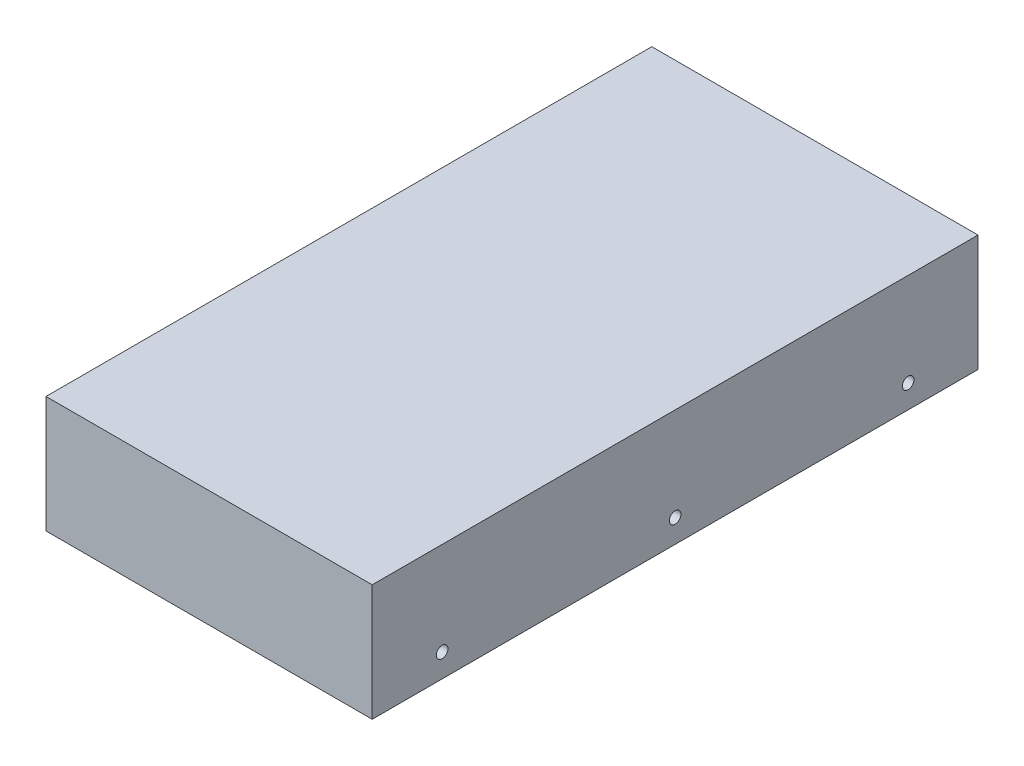
ISO-10303-21;
HEADER;
FILE_DESCRIPTION(('STEP AP214'),'2;1');
FILE_NAME('part.step','',(''),(''),'','','');
FILE_SCHEMA(('AUTOMOTIVE_DESIGN { 1 0 10303 214 1 1 1 1 }'));
ENDSEC;
DATA;
#1=APPLICATION_CONTEXT('core data for automotive mechanical design processes');
#2=APPLICATION_PROTOCOL_DEFINITION('international standard','automotive_design',2000,#1);
#3=PRODUCT_CONTEXT('',#1,'mechanical');
#4=PRODUCT('Part','Part','',(#3));
#5=PRODUCT_RELATED_PRODUCT_CATEGORY('part','',(#4));
#6=PRODUCT_DEFINITION_FORMATION('','',#4);
#7=PRODUCT_DEFINITION_CONTEXT('part definition',#1,'design');
#8=PRODUCT_DEFINITION('design','',#6,#7);
#9=PRODUCT_DEFINITION_SHAPE('','',#8);
#10=(LENGTH_UNIT() NAMED_UNIT(*) SI_UNIT(.MILLI.,.METRE.));
#11=(NAMED_UNIT(*) PLANE_ANGLE_UNIT() SI_UNIT($,.RADIAN.));
#12=(NAMED_UNIT(*) SI_UNIT($,.STERADIAN.) SOLID_ANGLE_UNIT());
#13=UNCERTAINTY_MEASURE_WITH_UNIT(LENGTH_MEASURE(1.E-05),#10,'distance_accuracy_value','');
#14=(GEOMETRIC_REPRESENTATION_CONTEXT(3) GLOBAL_UNCERTAINTY_ASSIGNED_CONTEXT((#13)) GLOBAL_UNIT_ASSIGNED_CONTEXT((#10,
#11,#12)) REPRESENTATION_CONTEXT('',''));
#15=CARTESIAN_POINT('',(0.,0.,0.));
#16=DIRECTION('',(0.,0.,1.));
#17=DIRECTION('',(1.,0.,0.));
#18=AXIS2_PLACEMENT_3D('',#15,#16,#17);
#19=CARTESIAN_POINT('',(177.8,0.,0.));
#20=DIRECTION('',(-1.,0.,0.));
#21=DIRECTION('',(0.,0.,1.));
#22=AXIS2_PLACEMENT_3D('',#19,#20,#21);
#23=PLANE('',#22);
#24=DIRECTION('',(0.,-1.,0.));
#25=VECTOR('',#24,1.);
#26=CARTESIAN_POINT('',(177.8,-25.4,330.2));
#27=LINE('',#26,#25);
#28=CARTESIAN_POINT('',(177.8,101.6,330.2));
#29=VERTEX_POINT('',#28);
#30=CARTESIAN_POINT('',(177.8,-25.4,330.2));
#31=VERTEX_POINT('',#30);
#32=EDGE_CURVE('E92',#29,#31,#27,.T.);
#33=ORIENTED_EDGE('',*,*,#32,.T.);
#34=DIRECTION('',(0.,0.,-1.));
#35=VECTOR('',#34,1.);
#36=CARTESIAN_POINT('',(177.8,-25.4,330.2));
#37=LINE('',#36,#35);
#38=CARTESIAN_POINT('',(177.8,-25.3999999999998,-330.2));
#39=VERTEX_POINT('',#38);
#40=EDGE_CURVE('E87',#31,#39,#37,.T.);
#41=ORIENTED_EDGE('',*,*,#40,.T.);
#42=DIRECTION('',(0.,1.,0.));
#43=VECTOR('',#42,1.);
#44=CARTESIAN_POINT('',(177.8,-25.3999999999998,-330.2));
#45=LINE('',#44,#43);
#46=CARTESIAN_POINT('',(177.8,101.6,-330.2));
#47=VERTEX_POINT('',#46);
#48=EDGE_CURVE('E90',#39,#47,#45,.T.);
#49=ORIENTED_EDGE('',*,*,#48,.T.);
#50=DIRECTION('',(0.,0.,1.));
#51=VECTOR('',#50,1.);
#52=CARTESIAN_POINT('',(177.8,101.6,330.2));
#53=LINE('',#52,#51);
#54=EDGE_CURVE('E57',#47,#29,#53,.T.);
#55=ORIENTED_EDGE('',*,*,#54,.T.);
#56=EDGE_LOOP('',(#33,#41,#49,#55));
#57=FACE_BOUND('',#56,.T.);
#58=CARTESIAN_POINT('',(177.8,0.,0.));
#59=DIRECTION('',(1.,0.,0.));
#60=DIRECTION('',(0.,0.,-1.));
#61=AXIS2_PLACEMENT_3D('',#58,#59,#60);
#62=CIRCLE('',#61,6.35);
#63=CARTESIAN_POINT('',(177.8,0.,-6.35));
#64=VERTEX_POINT('',#63);
#65=EDGE_CURVE('E112',#64,#64,#62,.T.);
#66=ORIENTED_EDGE('',*,*,#65,.F.);
#67=EDGE_LOOP('',(#66));
#68=FACE_BOUND('',#67,.T.);
#69=CARTESIAN_POINT('',(177.8,0.,254.));
#70=DIRECTION('',(1.,0.,0.));
#71=DIRECTION('',(0.,0.,-1.));
#72=AXIS2_PLACEMENT_3D('',#69,#70,#71);
#73=CIRCLE('',#72,6.35);
#74=CARTESIAN_POINT('',(177.8,0.,247.65));
#75=VERTEX_POINT('',#74);
#76=EDGE_CURVE('E134',#75,#75,#73,.T.);
#77=ORIENTED_EDGE('',*,*,#76,.F.);
#78=EDGE_LOOP('',(#77));
#79=FACE_BOUND('',#78,.T.);
#80=CARTESIAN_POINT('',(177.8,0.,-254.));
#81=DIRECTION('',(1.,0.,0.));
#82=DIRECTION('',(0.,0.,-1.));
#83=AXIS2_PLACEMENT_3D('',#80,#81,#82);
#84=CIRCLE('',#83,6.35);
#85=CARTESIAN_POINT('',(177.8,0.,-260.35));
#86=VERTEX_POINT('',#85);
#87=EDGE_CURVE('E142',#86,#86,#84,.T.);
#88=ORIENTED_EDGE('',*,*,#87,.F.);
#89=EDGE_LOOP('',(#88));
#90=FACE_BOUND('',#89,.T.);
#91=ADVANCED_FACE('F39',(#57,#68,#79,#90),#23,.F.);
#92=CARTESIAN_POINT('',(-177.8,0.,0.));
#93=DIRECTION('',(-1.,0.,0.));
#94=DIRECTION('',(0.,0.,1.));
#95=AXIS2_PLACEMENT_3D('',#92,#93,#94);
#96=PLANE('',#95);
#97=CARTESIAN_POINT('',(-177.8,0.,254.));
#98=DIRECTION('',(1.,0.,0.));
#99=DIRECTION('',(0.,0.,-1.));
#100=AXIS2_PLACEMENT_3D('',#97,#98,#99);
#101=CIRCLE('',#100,6.35);
#102=CARTESIAN_POINT('',(-177.8,0.,247.65));
#103=VERTEX_POINT('',#102);
#104=EDGE_CURVE('E138',#103,#103,#101,.T.);
#105=ORIENTED_EDGE('',*,*,#104,.T.);
#106=EDGE_LOOP('',(#105));
#107=FACE_BOUND('',#106,.T.);
#108=DIRECTION('',(0.,-1.,0.));
#109=VECTOR('',#108,1.);
#110=CARTESIAN_POINT('',(-177.8,-25.4,330.2));
#111=LINE('',#110,#109);
#112=CARTESIAN_POINT('',(-177.8,101.6,330.2));
#113=VERTEX_POINT('',#112);
#114=CARTESIAN_POINT('',(-177.8,-25.4,330.2));
#115=VERTEX_POINT('',#114);
#116=EDGE_CURVE('E108',#113,#115,#111,.T.);
#117=ORIENTED_EDGE('',*,*,#116,.F.);
#118=DIRECTION('',(0.,0.,1.));
#119=VECTOR('',#118,1.);
#120=CARTESIAN_POINT('',(-177.8,101.6,330.2));
#121=LINE('',#120,#119);
#122=CARTESIAN_POINT('',(-177.8,101.6,-330.2));
#123=VERTEX_POINT('',#122);
#124=EDGE_CURVE('E80',#123,#113,#121,.T.);
#125=ORIENTED_EDGE('',*,*,#124,.F.);
#126=DIRECTION('',(0.,1.,0.));
#127=VECTOR('',#126,1.);
#128=CARTESIAN_POINT('',(-177.8,-25.3999999999998,-330.2));
#129=LINE('',#128,#127);
#130=CARTESIAN_POINT('',(-177.8,-25.3999999999998,-330.2));
#131=VERTEX_POINT('',#130);
#132=EDGE_CURVE('E74',#131,#123,#129,.T.);
#133=ORIENTED_EDGE('',*,*,#132,.F.);
#134=DIRECTION('',(0.,0.,-1.));
#135=VECTOR('',#134,1.);
#136=CARTESIAN_POINT('',(-177.8,-25.4,330.2));
#137=LINE('',#136,#135);
#138=EDGE_CURVE('E97',#115,#131,#137,.T.);
#139=ORIENTED_EDGE('',*,*,#138,.F.);
#140=EDGE_LOOP('',(#117,#125,#133,#139));
#141=FACE_BOUND('',#140,.T.);
#142=CARTESIAN_POINT('',(-177.8,0.,0.));
#143=DIRECTION('',(1.,0.,0.));
#144=DIRECTION('',(0.,0.,-1.));
#145=AXIS2_PLACEMENT_3D('',#142,#143,#144);
#146=CIRCLE('',#145,6.35);
#147=CARTESIAN_POINT('',(-177.8,0.,-6.35));
#148=VERTEX_POINT('',#147);
#149=EDGE_CURVE('E130',#148,#148,#146,.T.);
#150=ORIENTED_EDGE('',*,*,#149,.T.);
#151=EDGE_LOOP('',(#150));
#152=FACE_BOUND('',#151,.T.);
#153=CARTESIAN_POINT('',(-177.8,0.,-254.));
#154=DIRECTION('',(1.,0.,0.));
#155=DIRECTION('',(0.,0.,-1.));
#156=AXIS2_PLACEMENT_3D('',#153,#154,#155);
#157=CIRCLE('',#156,6.35);
#158=CARTESIAN_POINT('',(-177.8,0.,-260.35));
#159=VERTEX_POINT('',#158);
#160=EDGE_CURVE('E146',#159,#159,#157,.T.);
#161=ORIENTED_EDGE('',*,*,#160,.T.);
#162=EDGE_LOOP('',(#161));
#163=FACE_BOUND('',#162,.T.);
#164=ADVANCED_FACE('F125',(#107,#141,#152,#163),#96,.T.);
#165=CARTESIAN_POINT('',(177.8,-25.4,330.2));
#166=DIRECTION('',(0.,0.,-1.));
#167=DIRECTION('',(0.,1.,0.));
#168=AXIS2_PLACEMENT_3D('',#165,#166,#167);
#169=PLANE('',#168);
#170=ORIENTED_EDGE('',*,*,#116,.T.);
#171=DIRECTION('',(-1.,0.,0.));
#172=VECTOR('',#171,1.);
#173=CARTESIAN_POINT('',(177.8,-25.4,330.2));
#174=LINE('',#173,#172);
#175=EDGE_CURVE('E11',#31,#115,#174,.T.);
#176=ORIENTED_EDGE('',*,*,#175,.F.);
#177=ORIENTED_EDGE('',*,*,#32,.F.);
#178=DIRECTION('',(-1.,0.,0.));
#179=VECTOR('',#178,1.);
#180=CARTESIAN_POINT('',(177.8,101.6,330.2));
#181=LINE('',#180,#179);
#182=EDGE_CURVE('E104',#29,#113,#181,.T.);
#183=ORIENTED_EDGE('',*,*,#182,.T.);
#184=EDGE_LOOP('',(#170,#176,#177,#183));
#185=FACE_BOUND('',#184,.T.);
#186=ADVANCED_FACE('F41',(#185),#169,.F.);
#187=CARTESIAN_POINT('',(177.8,-25.4,330.2));
#188=DIRECTION('',(0.,1.,0.));
#189=DIRECTION('',(0.,0.,1.));
#190=AXIS2_PLACEMENT_3D('',#187,#188,#189);
#191=PLANE('',#190);
#192=ORIENTED_EDGE('',*,*,#138,.T.);
#193=DIRECTION('',(-1.,0.,0.));
#194=VECTOR('',#193,1.);
#195=CARTESIAN_POINT('',(177.8,-25.3999999999998,-330.2));
#196=LINE('',#195,#194);
#197=EDGE_CURVE('E49',#39,#131,#196,.T.);
#198=ORIENTED_EDGE('',*,*,#197,.F.);
#199=ORIENTED_EDGE('',*,*,#40,.F.);
#200=ORIENTED_EDGE('',*,*,#175,.T.);
#201=EDGE_LOOP('',(#192,#198,#199,#200));
#202=FACE_BOUND('',#201,.T.);
#203=ADVANCED_FACE('F96',(#202),#191,.F.);
#204=CARTESIAN_POINT('',(177.8,-25.3999999999998,-330.2));
#205=DIRECTION('',(0.,0.,1.));
#206=DIRECTION('',(0.,-1.,0.));
#207=AXIS2_PLACEMENT_3D('',#204,#205,#206);
#208=PLANE('',#207);
#209=ORIENTED_EDGE('',*,*,#132,.T.);
#210=DIRECTION('',(-1.,0.,0.));
#211=VECTOR('',#210,1.);
#212=CARTESIAN_POINT('',(177.8,101.6,-330.2));
#213=LINE('',#212,#211);
#214=EDGE_CURVE('E99',#47,#123,#213,.T.);
#215=ORIENTED_EDGE('',*,*,#214,.F.);
#216=ORIENTED_EDGE('',*,*,#48,.F.);
#217=ORIENTED_EDGE('',*,*,#197,.T.);
#218=EDGE_LOOP('',(#209,#215,#216,#217));
#219=FACE_BOUND('',#218,.T.);
#220=ADVANCED_FACE('F100',(#219),#208,.F.);
#221=CARTESIAN_POINT('',(177.8,101.6,330.2));
#222=DIRECTION('',(0.,-1.,0.));
#223=DIRECTION('',(0.,0.,-1.));
#224=AXIS2_PLACEMENT_3D('',#221,#222,#223);
#225=PLANE('',#224);
#226=ORIENTED_EDGE('',*,*,#124,.T.);
#227=ORIENTED_EDGE('',*,*,#182,.F.);
#228=ORIENTED_EDGE('',*,*,#54,.F.);
#229=ORIENTED_EDGE('',*,*,#214,.T.);
#230=EDGE_LOOP('',(#226,#227,#228,#229));
#231=FACE_BOUND('',#230,.T.);
#232=ADVANCED_FACE('F122',(#231),#225,.F.);
#233=CARTESIAN_POINT('',(177.8,0.,0.));
#234=DIRECTION('',(-1.,0.,0.));
#235=DIRECTION('',(0.,0.,1.));
#236=AXIS2_PLACEMENT_3D('',#233,#234,#235);
#237=CYLINDRICAL_SURFACE('',#236,6.35);
#238=ORIENTED_EDGE('',*,*,#65,.T.);
#239=EDGE_LOOP('',(#238));
#240=FACE_BOUND('',#239,.T.);
#241=ORIENTED_EDGE('',*,*,#149,.F.);
#242=EDGE_LOOP('',(#241));
#243=FACE_BOUND('',#242,.T.);
#244=ADVANCED_FACE('F165',(#240,#243),#237,.F.);
#245=CARTESIAN_POINT('',(177.8,0.,254.));
#246=DIRECTION('',(-1.,0.,0.));
#247=DIRECTION('',(0.,0.,1.));
#248=AXIS2_PLACEMENT_3D('',#245,#246,#247);
#249=CYLINDRICAL_SURFACE('',#248,6.35);
#250=ORIENTED_EDGE('',*,*,#76,.T.);
#251=EDGE_LOOP('',(#250));
#252=FACE_BOUND('',#251,.T.);
#253=ORIENTED_EDGE('',*,*,#104,.F.);
#254=EDGE_LOOP('',(#253));
#255=FACE_BOUND('',#254,.T.);
#256=ADVANCED_FACE('F211',(#252,#255),#249,.F.);
#257=CARTESIAN_POINT('',(177.8,0.,-254.));
#258=DIRECTION('',(-1.,0.,0.));
#259=DIRECTION('',(0.,0.,1.));
#260=AXIS2_PLACEMENT_3D('',#257,#258,#259);
#261=CYLINDRICAL_SURFACE('',#260,6.35);
#262=ORIENTED_EDGE('',*,*,#87,.T.);
#263=EDGE_LOOP('',(#262));
#264=FACE_BOUND('',#263,.T.);
#265=ORIENTED_EDGE('',*,*,#160,.F.);
#266=EDGE_LOOP('',(#265));
#267=FACE_BOUND('',#266,.T.);
#268=ADVANCED_FACE('F154',(#264,#267),#261,.F.);
#269=CLOSED_SHELL('',(#91,#164,#186,#203,#220,#232,#244,#256,#268));
#270=MANIFOLD_SOLID_BREP('B2',#269);
#271=ADVANCED_BREP_SHAPE_REPRESENTATION('',(#18,#270),#14);
#272=SHAPE_DEFINITION_REPRESENTATION(#9,#271);
ENDSEC;
END-ISO-10303-21;
